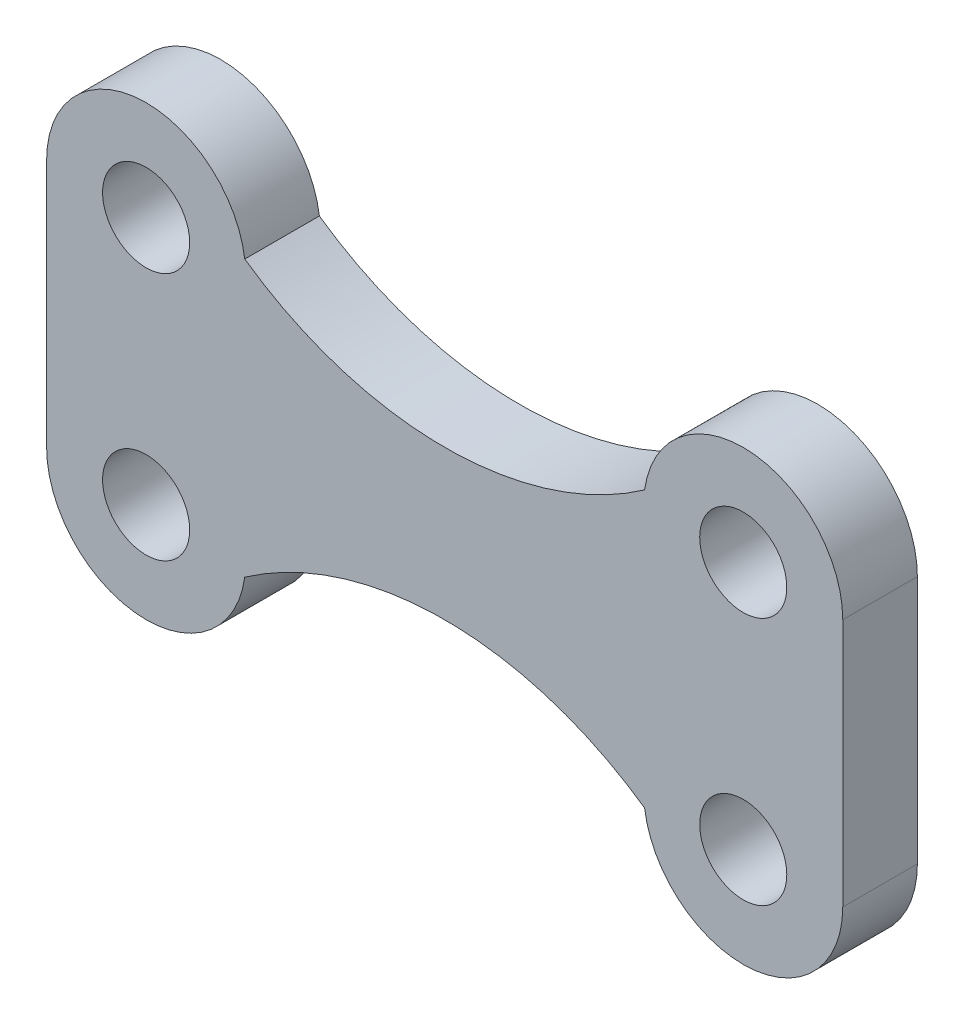
ISO-10303-21;
HEADER;
FILE_DESCRIPTION(('STEP AP214'),'2;1');
FILE_NAME('part.step','',(''),(''),'','','');
FILE_SCHEMA(('AUTOMOTIVE_DESIGN { 1 0 10303 214 1 1 1 1 }'));
ENDSEC;
DATA;
#1=APPLICATION_CONTEXT('core data for automotive mechanical design processes');
#2=APPLICATION_PROTOCOL_DEFINITION('international standard','automotive_design',2000,#1);
#3=PRODUCT_CONTEXT('',#1,'mechanical');
#4=PRODUCT('Part','Part','',(#3));
#5=PRODUCT_RELATED_PRODUCT_CATEGORY('part','',(#4));
#6=PRODUCT_DEFINITION_FORMATION('','',#4);
#7=PRODUCT_DEFINITION_CONTEXT('part definition',#1,'design');
#8=PRODUCT_DEFINITION('design','',#6,#7);
#9=PRODUCT_DEFINITION_SHAPE('','',#8);
#10=(LENGTH_UNIT() NAMED_UNIT(*) SI_UNIT(.MILLI.,.METRE.));
#11=(NAMED_UNIT(*) PLANE_ANGLE_UNIT() SI_UNIT($,.RADIAN.));
#12=(NAMED_UNIT(*) SI_UNIT($,.STERADIAN.) SOLID_ANGLE_UNIT());
#13=UNCERTAINTY_MEASURE_WITH_UNIT(LENGTH_MEASURE(1.E-05),#10,'distance_accuracy_value','');
#14=(GEOMETRIC_REPRESENTATION_CONTEXT(3) GLOBAL_UNCERTAINTY_ASSIGNED_CONTEXT((#13)) GLOBAL_UNIT_ASSIGNED_CONTEXT((#10,
#11,#12)) REPRESENTATION_CONTEXT('',''));
#15=CARTESIAN_POINT('',(0.,0.,0.));
#16=DIRECTION('',(0.,0.,1.));
#17=DIRECTION('',(1.,0.,0.));
#18=AXIS2_PLACEMENT_3D('',#15,#16,#17);
#19=CARTESIAN_POINT('',(-6.,-6.,3.));
#20=DIRECTION('',(0.,0.,1.));
#21=DIRECTION('',(1.,0.,0.));
#22=AXIS2_PLACEMENT_3D('',#19,#20,#21);
#23=PLANE('',#22);
#24=CARTESIAN_POINT('',(0.,-34.,3.));
#25=DIRECTION('',(0.,0.,-1.));
#26=DIRECTION('',(1.,0.,0.));
#27=AXIS2_PLACEMENT_3D('',#24,#25,#26);
#28=CIRCLE('',#27,14.);
#29=CARTESIAN_POINT('',(-8.03608634989974,-22.5360863498997,3.));
#30=VERTEX_POINT('',#29);
#31=CARTESIAN_POINT('',(8.03608634989974,-22.5360863498997,3.));
#32=VERTEX_POINT('',#31);
#33=EDGE_CURVE('E246',#30,#32,#28,.T.);
#34=ORIENTED_EDGE('',*,*,#33,.T.);
#35=CARTESIAN_POINT('',(12.,-22.,3.));
#36=DIRECTION('',(0.,0.,1.));
#37=DIRECTION('',(1.,0.,0.));
#38=AXIS2_PLACEMENT_3D('',#35,#36,#37);
#39=CIRCLE('',#38,4.);
#40=CARTESIAN_POINT('',(16.,-22.,3.));
#41=VERTEX_POINT('',#40);
#42=EDGE_CURVE('E134',#41,#32,#39,.F.);
#43=ORIENTED_EDGE('',*,*,#42,.F.);
#44=DIRECTION('',(0.,-1.,0.));
#45=VECTOR('',#44,1.);
#46=CARTESIAN_POINT('',(16.,0.,3.));
#47=LINE('',#46,#45);
#48=CARTESIAN_POINT('',(16.,-12.,3.));
#49=VERTEX_POINT('',#48);
#50=EDGE_CURVE('E116',#49,#41,#47,.T.);
#51=ORIENTED_EDGE('',*,*,#50,.F.);
#52=CARTESIAN_POINT('',(12.,-12.,3.));
#53=DIRECTION('',(0.,0.,1.));
#54=DIRECTION('',(-1.,0.,0.));
#55=AXIS2_PLACEMENT_3D('',#52,#53,#54);
#56=CIRCLE('',#55,4.);
#57=CARTESIAN_POINT('',(8.03608634989974,-11.4639136501003,3.));
#58=VERTEX_POINT('',#57);
#59=EDGE_CURVE('E173',#49,#58,#56,.T.);
#60=ORIENTED_EDGE('',*,*,#59,.T.);
#61=CARTESIAN_POINT('',(0.,0.,3.));
#62=DIRECTION('',(0.,0.,-1.));
#63=DIRECTION('',(1.,0.,0.));
#64=AXIS2_PLACEMENT_3D('',#61,#62,#63);
#65=CIRCLE('',#64,14.);
#66=CARTESIAN_POINT('',(-8.03608634989973,-11.4639136501003,3.));
#67=VERTEX_POINT('',#66);
#68=EDGE_CURVE('E176',#58,#67,#65,.T.);
#69=ORIENTED_EDGE('',*,*,#68,.T.);
#70=CARTESIAN_POINT('',(-12.,-12.,3.));
#71=DIRECTION('',(0.,0.,1.));
#72=DIRECTION('',(1.,0.,0.));
#73=AXIS2_PLACEMENT_3D('',#70,#71,#72);
#74=CIRCLE('',#73,4.);
#75=CARTESIAN_POINT('',(-16.,-12.,3.));
#76=VERTEX_POINT('',#75);
#77=EDGE_CURVE('E170',#67,#76,#74,.T.);
#78=ORIENTED_EDGE('',*,*,#77,.T.);
#79=DIRECTION('',(0.,-1.,0.));
#80=VECTOR('',#79,1.);
#81=CARTESIAN_POINT('',(-16.,0.,3.));
#82=LINE('',#81,#80);
#83=CARTESIAN_POINT('',(-16.,-22.,3.));
#84=VERTEX_POINT('',#83);
#85=EDGE_CURVE('E150',#76,#84,#82,.T.);
#86=ORIENTED_EDGE('',*,*,#85,.T.);
#87=CARTESIAN_POINT('',(-12.,-22.,3.));
#88=DIRECTION('',(0.,0.,1.));
#89=DIRECTION('',(1.,0.,0.));
#90=AXIS2_PLACEMENT_3D('',#87,#88,#89);
#91=CIRCLE('',#90,4.);
#92=EDGE_CURVE('E58',#84,#30,#91,.T.);
#93=ORIENTED_EDGE('',*,*,#92,.T.);
#94=EDGE_LOOP('',(#34,#43,#51,#60,#69,#78,#86,#93));
#95=FACE_BOUND('',#94,.T.);
#96=CARTESIAN_POINT('',(12.,-22.,3.));
#97=DIRECTION('',(0.,0.,1.));
#98=DIRECTION('',(1.,0.,0.));
#99=AXIS2_PLACEMENT_3D('',#96,#97,#98);
#100=CIRCLE('',#99,1.75);
#101=CARTESIAN_POINT('',(13.75,-22.,3.));
#102=VERTEX_POINT('',#101);
#103=EDGE_CURVE('E124',#102,#102,#100,.F.);
#104=ORIENTED_EDGE('',*,*,#103,.T.);
#105=EDGE_LOOP('',(#104));
#106=FACE_BOUND('',#105,.T.);
#107=CARTESIAN_POINT('',(12.,-12.,3.));
#108=DIRECTION('',(0.,0.,1.));
#109=DIRECTION('',(-1.,0.,0.));
#110=AXIS2_PLACEMENT_3D('',#107,#108,#109);
#111=CIRCLE('',#110,1.75);
#112=CARTESIAN_POINT('',(10.25,-12.,3.));
#113=VERTEX_POINT('',#112);
#114=EDGE_CURVE('E158',#113,#113,#111,.T.);
#115=ORIENTED_EDGE('',*,*,#114,.F.);
#116=EDGE_LOOP('',(#115));
#117=FACE_BOUND('',#116,.T.);
#118=CARTESIAN_POINT('',(-12.,-22.,3.));
#119=DIRECTION('',(0.,0.,1.));
#120=DIRECTION('',(1.,0.,0.));
#121=AXIS2_PLACEMENT_3D('',#118,#119,#120);
#122=CIRCLE('',#121,1.75);
#123=CARTESIAN_POINT('',(-10.25,-22.,3.));
#124=VERTEX_POINT('',#123);
#125=EDGE_CURVE('E137',#124,#124,#122,.T.);
#126=ORIENTED_EDGE('',*,*,#125,.F.);
#127=EDGE_LOOP('',(#126));
#128=FACE_BOUND('',#127,.T.);
#129=CARTESIAN_POINT('',(-12.,-12.,3.));
#130=DIRECTION('',(0.,0.,1.));
#131=DIRECTION('',(1.,0.,0.));
#132=AXIS2_PLACEMENT_3D('',#129,#130,#131);
#133=CIRCLE('',#132,1.75);
#134=CARTESIAN_POINT('',(-10.25,-12.,3.));
#135=VERTEX_POINT('',#134);
#136=EDGE_CURVE('E164',#135,#135,#133,.T.);
#137=ORIENTED_EDGE('',*,*,#136,.F.);
#138=EDGE_LOOP('',(#137));
#139=FACE_BOUND('',#138,.T.);
#140=ADVANCED_FACE('F35',(#95,#106,#117,#128,#139),#23,.T.);
#141=CARTESIAN_POINT('',(-6.,-6.,0.));
#142=DIRECTION('',(0.,0.,1.));
#143=DIRECTION('',(1.,0.,0.));
#144=AXIS2_PLACEMENT_3D('',#141,#142,#143);
#145=PLANE('',#144);
#146=CARTESIAN_POINT('',(0.,-34.,0.));
#147=DIRECTION('',(0.,0.,-1.));
#148=DIRECTION('',(1.,0.,0.));
#149=AXIS2_PLACEMENT_3D('',#146,#147,#148);
#150=CIRCLE('',#149,14.);
#151=CARTESIAN_POINT('',(-8.03608634989974,-22.5360863498997,0.));
#152=VERTEX_POINT('',#151);
#153=CARTESIAN_POINT('',(8.03608634989974,-22.5360863498997,0.));
#154=VERTEX_POINT('',#153);
#155=EDGE_CURVE('E50',#152,#154,#150,.T.);
#156=ORIENTED_EDGE('',*,*,#155,.F.);
#157=CARTESIAN_POINT('',(-12.,-22.,0.));
#158=DIRECTION('',(0.,0.,1.));
#159=DIRECTION('',(1.,0.,0.));
#160=AXIS2_PLACEMENT_3D('',#157,#158,#159);
#161=CIRCLE('',#160,4.);
#162=CARTESIAN_POINT('',(-16.,-22.,0.));
#163=VERTEX_POINT('',#162);
#164=EDGE_CURVE('E145',#163,#152,#161,.T.);
#165=ORIENTED_EDGE('',*,*,#164,.F.);
#166=DIRECTION('',(0.,-1.,0.));
#167=VECTOR('',#166,1.);
#168=CARTESIAN_POINT('',(-16.,0.,0.));
#169=LINE('',#168,#167);
#170=CARTESIAN_POINT('',(-16.,-12.,0.));
#171=VERTEX_POINT('',#170);
#172=EDGE_CURVE('E142',#171,#163,#169,.T.);
#173=ORIENTED_EDGE('',*,*,#172,.F.);
#174=CARTESIAN_POINT('',(-12.,-12.,0.));
#175=DIRECTION('',(0.,0.,1.));
#176=DIRECTION('',(1.,0.,0.));
#177=AXIS2_PLACEMENT_3D('',#174,#175,#176);
#178=CIRCLE('',#177,4.);
#179=CARTESIAN_POINT('',(-8.03608634989973,-11.4639136501003,0.));
#180=VERTEX_POINT('',#179);
#181=EDGE_CURVE('E167',#180,#171,#178,.T.);
#182=ORIENTED_EDGE('',*,*,#181,.F.);
#183=CARTESIAN_POINT('',(0.,0.,0.));
#184=DIRECTION('',(0.,0.,-1.));
#185=DIRECTION('',(1.,0.,0.));
#186=AXIS2_PLACEMENT_3D('',#183,#184,#185);
#187=CIRCLE('',#186,14.);
#188=CARTESIAN_POINT('',(8.03608634989974,-11.4639136501003,0.));
#189=VERTEX_POINT('',#188);
#190=EDGE_CURVE('E174',#189,#180,#187,.T.);
#191=ORIENTED_EDGE('',*,*,#190,.F.);
#192=CARTESIAN_POINT('',(12.,-12.,0.));
#193=DIRECTION('',(0.,0.,1.));
#194=DIRECTION('',(-1.,0.,0.));
#195=AXIS2_PLACEMENT_3D('',#192,#193,#194);
#196=CIRCLE('',#195,4.);
#197=CARTESIAN_POINT('',(16.,-12.,0.));
#198=VERTEX_POINT('',#197);
#199=EDGE_CURVE('E107',#198,#189,#196,.T.);
#200=ORIENTED_EDGE('',*,*,#199,.F.);
#201=DIRECTION('',(0.,-1.,0.));
#202=VECTOR('',#201,1.);
#203=CARTESIAN_POINT('',(16.,0.,0.));
#204=LINE('',#203,#202);
#205=CARTESIAN_POINT('',(16.,-22.,0.));
#206=VERTEX_POINT('',#205);
#207=EDGE_CURVE('E100',#198,#206,#204,.T.);
#208=ORIENTED_EDGE('',*,*,#207,.T.);
#209=CARTESIAN_POINT('',(12.,-22.,0.));
#210=DIRECTION('',(0.,0.,1.));
#211=DIRECTION('',(1.,0.,0.));
#212=AXIS2_PLACEMENT_3D('',#209,#210,#211);
#213=CIRCLE('',#212,4.);
#214=EDGE_CURVE('E105',#206,#154,#213,.F.);
#215=ORIENTED_EDGE('',*,*,#214,.T.);
#216=EDGE_LOOP('',(#156,#165,#173,#182,#191,#200,#208,#215));
#217=FACE_BOUND('',#216,.T.);
#218=CARTESIAN_POINT('',(12.,-22.,0.));
#219=DIRECTION('',(0.,0.,1.));
#220=DIRECTION('',(1.,0.,0.));
#221=AXIS2_PLACEMENT_3D('',#218,#219,#220);
#222=CIRCLE('',#221,1.75);
#223=CARTESIAN_POINT('',(13.75,-22.,0.));
#224=VERTEX_POINT('',#223);
#225=EDGE_CURVE('E111',#224,#224,#222,.F.);
#226=ORIENTED_EDGE('',*,*,#225,.F.);
#227=EDGE_LOOP('',(#226));
#228=FACE_BOUND('',#227,.T.);
#229=CARTESIAN_POINT('',(12.,-12.,0.));
#230=DIRECTION('',(0.,0.,1.));
#231=DIRECTION('',(-1.,0.,0.));
#232=AXIS2_PLACEMENT_3D('',#229,#230,#231);
#233=CIRCLE('',#232,1.75);
#234=CARTESIAN_POINT('',(10.25,-12.,0.));
#235=VERTEX_POINT('',#234);
#236=EDGE_CURVE('E156',#235,#235,#233,.T.);
#237=ORIENTED_EDGE('',*,*,#236,.T.);
#238=EDGE_LOOP('',(#237));
#239=FACE_BOUND('',#238,.T.);
#240=CARTESIAN_POINT('',(-12.,-22.,0.));
#241=DIRECTION('',(0.,0.,1.));
#242=DIRECTION('',(1.,0.,0.));
#243=AXIS2_PLACEMENT_3D('',#240,#241,#242);
#244=CIRCLE('',#243,1.75);
#245=CARTESIAN_POINT('',(-10.25,-22.,0.));
#246=VERTEX_POINT('',#245);
#247=EDGE_CURVE('E139',#246,#246,#244,.T.);
#248=ORIENTED_EDGE('',*,*,#247,.T.);
#249=EDGE_LOOP('',(#248));
#250=FACE_BOUND('',#249,.T.);
#251=CARTESIAN_POINT('',(-12.,-12.,0.));
#252=DIRECTION('',(0.,0.,1.));
#253=DIRECTION('',(1.,0.,0.));
#254=AXIS2_PLACEMENT_3D('',#251,#252,#253);
#255=CIRCLE('',#254,1.75);
#256=CARTESIAN_POINT('',(-10.25,-12.,0.));
#257=VERTEX_POINT('',#256);
#258=EDGE_CURVE('E161',#257,#257,#255,.T.);
#259=ORIENTED_EDGE('',*,*,#258,.T.);
#260=EDGE_LOOP('',(#259));
#261=FACE_BOUND('',#260,.T.);
#262=ADVANCED_FACE('F102',(#217,#228,#239,#250,#261),#145,.F.);
#263=CARTESIAN_POINT('',(-12.,-12.,3.));
#264=DIRECTION('',(0.,0.,-1.));
#265=DIRECTION('',(-1.,0.,0.));
#266=AXIS2_PLACEMENT_3D('',#263,#264,#265);
#267=CYLINDRICAL_SURFACE('',#266,4.);
#268=ORIENTED_EDGE('',*,*,#181,.T.);
#269=DIRECTION('',(0.,0.,1.));
#270=VECTOR('',#269,1.);
#271=CARTESIAN_POINT('',(-16.,-12.,0.));
#272=LINE('',#271,#270);
#273=EDGE_CURVE('E153',#171,#76,#272,.T.);
#274=ORIENTED_EDGE('',*,*,#273,.T.);
#275=ORIENTED_EDGE('',*,*,#77,.F.);
#276=DIRECTION('',(0.,0.,-1.));
#277=VECTOR('',#276,1.);
#278=CARTESIAN_POINT('',(-8.03608634989973,-11.4639136501003,3.));
#279=LINE('',#278,#277);
#280=EDGE_CURVE('E178',#67,#180,#279,.T.);
#281=ORIENTED_EDGE('',*,*,#280,.T.);
#282=EDGE_LOOP('',(#268,#274,#275,#281));
#283=FACE_BOUND('',#282,.T.);
#284=ADVANCED_FACE('F37',(#283),#267,.T.);
#285=CARTESIAN_POINT('',(12.,-12.,3.));
#286=DIRECTION('',(0.,0.,-1.));
#287=DIRECTION('',(-1.,0.,0.));
#288=AXIS2_PLACEMENT_3D('',#285,#286,#287);
#289=CYLINDRICAL_SURFACE('',#288,4.);
#290=ORIENTED_EDGE('',*,*,#59,.F.);
#291=DIRECTION('',(0.,0.,1.));
#292=VECTOR('',#291,1.);
#293=CARTESIAN_POINT('',(16.,-12.,0.));
#294=LINE('',#293,#292);
#295=EDGE_CURVE('E120',#198,#49,#294,.T.);
#296=ORIENTED_EDGE('',*,*,#295,.F.);
#297=ORIENTED_EDGE('',*,*,#199,.T.);
#298=DIRECTION('',(0.,0.,-1.));
#299=VECTOR('',#298,1.);
#300=CARTESIAN_POINT('',(8.03608634989974,-11.4639136501003,3.));
#301=LINE('',#300,#299);
#302=EDGE_CURVE('E43',#58,#189,#301,.T.);
#303=ORIENTED_EDGE('',*,*,#302,.F.);
#304=EDGE_LOOP('',(#290,#296,#297,#303));
#305=FACE_BOUND('',#304,.T.);
#306=ADVANCED_FACE('F197',(#305),#289,.T.);
#307=CARTESIAN_POINT('',(0.,0.,3.));
#308=DIRECTION('',(0.,0.,-1.));
#309=DIRECTION('',(-1.,0.,0.));
#310=AXIS2_PLACEMENT_3D('',#307,#308,#309);
#311=CYLINDRICAL_SURFACE('',#310,14.);
#312=ORIENTED_EDGE('',*,*,#190,.T.);
#313=ORIENTED_EDGE('',*,*,#280,.F.);
#314=ORIENTED_EDGE('',*,*,#68,.F.);
#315=ORIENTED_EDGE('',*,*,#302,.T.);
#316=EDGE_LOOP('',(#312,#313,#314,#315));
#317=FACE_BOUND('',#316,.T.);
#318=ADVANCED_FACE('F188',(#317),#311,.F.);
#319=CARTESIAN_POINT('',(-12.,-12.,3.));
#320=DIRECTION('',(0.,0.,-1.));
#321=DIRECTION('',(-1.,0.,0.));
#322=AXIS2_PLACEMENT_3D('',#319,#320,#321);
#323=CYLINDRICAL_SURFACE('',#322,1.75);
#324=ORIENTED_EDGE('',*,*,#136,.T.);
#325=EDGE_LOOP('',(#324));
#326=FACE_BOUND('',#325,.T.);
#327=ORIENTED_EDGE('',*,*,#258,.F.);
#328=EDGE_LOOP('',(#327));
#329=FACE_BOUND('',#328,.T.);
#330=ADVANCED_FACE('F203',(#326,#329),#323,.F.);
#331=CARTESIAN_POINT('',(12.,-12.,3.));
#332=DIRECTION('',(0.,0.,-1.));
#333=DIRECTION('',(-1.,0.,0.));
#334=AXIS2_PLACEMENT_3D('',#331,#332,#333);
#335=CYLINDRICAL_SURFACE('',#334,1.75);
#336=ORIENTED_EDGE('',*,*,#114,.T.);
#337=EDGE_LOOP('',(#336));
#338=FACE_BOUND('',#337,.T.);
#339=ORIENTED_EDGE('',*,*,#236,.F.);
#340=EDGE_LOOP('',(#339));
#341=FACE_BOUND('',#340,.T.);
#342=ADVANCED_FACE('F214',(#338,#341),#335,.F.);
#343=CARTESIAN_POINT('',(-16.,0.,0.));
#344=DIRECTION('',(-1.,0.,0.));
#345=DIRECTION('',(0.,0.,1.));
#346=AXIS2_PLACEMENT_3D('',#343,#344,#345);
#347=PLANE('',#346);
#348=ORIENTED_EDGE('',*,*,#85,.F.);
#349=ORIENTED_EDGE('',*,*,#273,.F.);
#350=ORIENTED_EDGE('',*,*,#172,.T.);
#351=DIRECTION('',(0.,0.,1.));
#352=VECTOR('',#351,1.);
#353=CARTESIAN_POINT('',(-16.,-22.,0.));
#354=LINE('',#353,#352);
#355=EDGE_CURVE('E147',#163,#84,#354,.T.);
#356=ORIENTED_EDGE('',*,*,#355,.T.);
#357=EDGE_LOOP('',(#348,#349,#350,#356));
#358=FACE_BOUND('',#357,.T.);
#359=ADVANCED_FACE('F218',(#358),#347,.T.);
#360=CARTESIAN_POINT('',(-12.,-22.,0.));
#361=DIRECTION('',(0.,0.,1.));
#362=DIRECTION('',(1.,0.,0.));
#363=AXIS2_PLACEMENT_3D('',#360,#361,#362);
#364=CYLINDRICAL_SURFACE('',#363,1.75);
#365=ORIENTED_EDGE('',*,*,#247,.F.);
#366=EDGE_LOOP('',(#365));
#367=FACE_BOUND('',#366,.T.);
#368=ORIENTED_EDGE('',*,*,#125,.T.);
#369=EDGE_LOOP('',(#368));
#370=FACE_BOUND('',#369,.T.);
#371=ADVANCED_FACE('F220',(#367,#370),#364,.F.);
#372=CARTESIAN_POINT('',(-12.,-22.,0.));
#373=DIRECTION('',(0.,0.,1.));
#374=DIRECTION('',(1.,0.,0.));
#375=AXIS2_PLACEMENT_3D('',#372,#373,#374);
#376=CYLINDRICAL_SURFACE('',#375,4.);
#377=ORIENTED_EDGE('',*,*,#164,.T.);
#378=DIRECTION('',(0.,0.,1.));
#379=VECTOR('',#378,1.);
#380=CARTESIAN_POINT('',(-8.03608634989974,-22.5360863498997,1.5));
#381=LINE('',#380,#379);
#382=EDGE_CURVE('E129',#30,#152,#381,.F.);
#383=ORIENTED_EDGE('',*,*,#382,.F.);
#384=ORIENTED_EDGE('',*,*,#92,.F.);
#385=ORIENTED_EDGE('',*,*,#355,.F.);
#386=EDGE_LOOP('',(#377,#383,#384,#385));
#387=FACE_BOUND('',#386,.T.);
#388=ADVANCED_FACE('F223',(#387),#376,.T.);
#389=CARTESIAN_POINT('',(12.,-22.,0.));
#390=DIRECTION('',(0.,0.,1.));
#391=DIRECTION('',(1.,0.,0.));
#392=AXIS2_PLACEMENT_3D('',#389,#390,#391);
#393=CYLINDRICAL_SURFACE('',#392,4.);
#394=DIRECTION('',(0.,0.,1.));
#395=VECTOR('',#394,1.);
#396=CARTESIAN_POINT('',(8.03608634989974,-22.5360863498997,1.5));
#397=LINE('',#396,#395);
#398=EDGE_CURVE('E11',#32,#154,#397,.F.);
#399=ORIENTED_EDGE('',*,*,#398,.T.);
#400=ORIENTED_EDGE('',*,*,#214,.F.);
#401=DIRECTION('',(0.,0.,1.));
#402=VECTOR('',#401,1.);
#403=CARTESIAN_POINT('',(16.,-22.,0.));
#404=LINE('',#403,#402);
#405=EDGE_CURVE('E114',#206,#41,#404,.T.);
#406=ORIENTED_EDGE('',*,*,#405,.T.);
#407=ORIENTED_EDGE('',*,*,#42,.T.);
#408=EDGE_LOOP('',(#399,#400,#406,#407));
#409=FACE_BOUND('',#408,.T.);
#410=ADVANCED_FACE('F122',(#409),#393,.T.);
#411=CARTESIAN_POINT('',(16.,0.,0.));
#412=DIRECTION('',(-1.,0.,0.));
#413=DIRECTION('',(0.,0.,1.));
#414=AXIS2_PLACEMENT_3D('',#411,#412,#413);
#415=PLANE('',#414);
#416=ORIENTED_EDGE('',*,*,#50,.T.);
#417=ORIENTED_EDGE('',*,*,#405,.F.);
#418=ORIENTED_EDGE('',*,*,#207,.F.);
#419=ORIENTED_EDGE('',*,*,#295,.T.);
#420=EDGE_LOOP('',(#416,#417,#418,#419));
#421=FACE_BOUND('',#420,.T.);
#422=ADVANCED_FACE('F115',(#421),#415,.F.);
#423=CARTESIAN_POINT('',(12.,-22.,0.));
#424=DIRECTION('',(0.,0.,1.));
#425=DIRECTION('',(1.,0.,0.));
#426=AXIS2_PLACEMENT_3D('',#423,#424,#425);
#427=CYLINDRICAL_SURFACE('',#426,1.75);
#428=ORIENTED_EDGE('',*,*,#225,.T.);
#429=EDGE_LOOP('',(#428));
#430=FACE_BOUND('',#429,.T.);
#431=ORIENTED_EDGE('',*,*,#103,.F.);
#432=EDGE_LOOP('',(#431));
#433=FACE_BOUND('',#432,.T.);
#434=ADVANCED_FACE('F235',(#430,#433),#427,.F.);
#435=CARTESIAN_POINT('',(0.,-34.,0.));
#436=DIRECTION('',(0.,0.,1.));
#437=DIRECTION('',(1.,0.,0.));
#438=AXIS2_PLACEMENT_3D('',#435,#436,#437);
#439=CYLINDRICAL_SURFACE('',#438,14.);
#440=ORIENTED_EDGE('',*,*,#398,.F.);
#441=ORIENTED_EDGE('',*,*,#33,.F.);
#442=ORIENTED_EDGE('',*,*,#382,.T.);
#443=ORIENTED_EDGE('',*,*,#155,.T.);
#444=EDGE_LOOP('',(#440,#441,#442,#443));
#445=FACE_BOUND('',#444,.T.);
#446=ADVANCED_FACE('F238',(#445),#439,.F.);
#447=CLOSED_SHELL('',(#140,#262,#284,#306,#318,#330,#342,#359,#371,#388,#410,#422,#434,#446));
#448=MANIFOLD_SOLID_BREP('B2',#447);
#449=ADVANCED_BREP_SHAPE_REPRESENTATION('',(#18,#448),#14);
#450=SHAPE_DEFINITION_REPRESENTATION(#9,#449);
ENDSEC;
END-ISO-10303-21;
